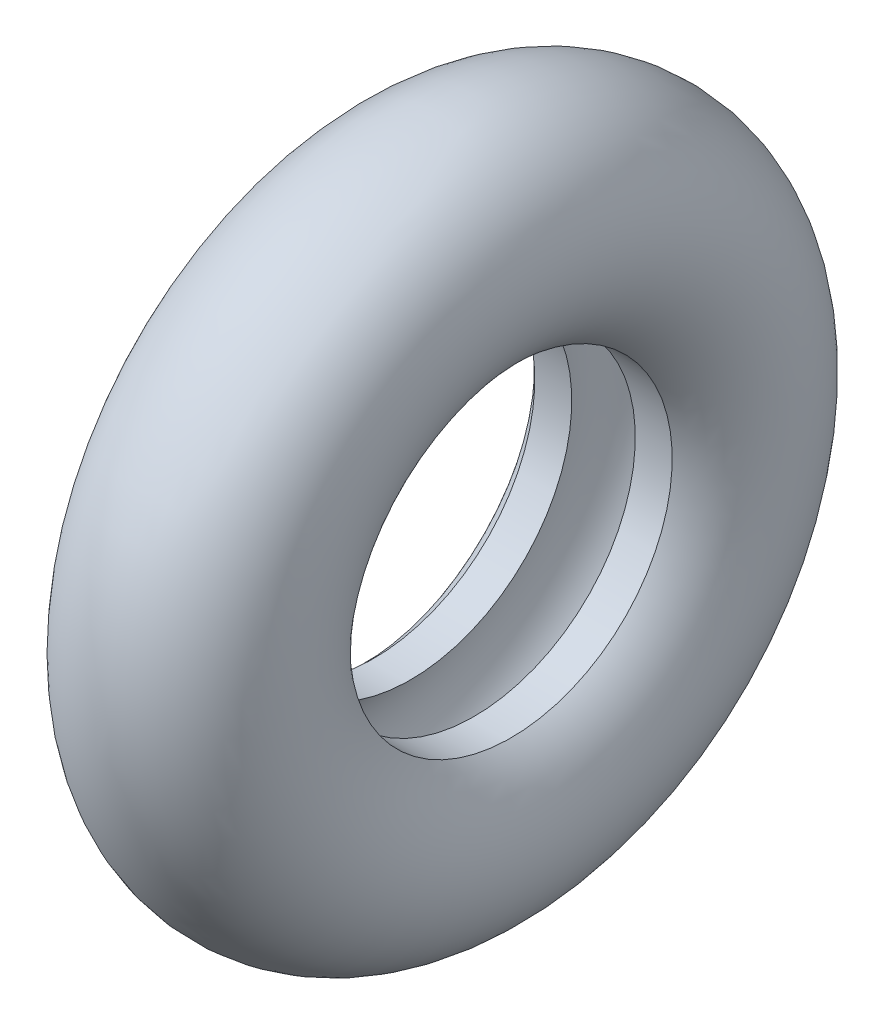
ISO-10303-21;
HEADER;
FILE_DESCRIPTION(('STEP AP214'),'2;1');
FILE_NAME('part.step','',(''),(''),'','','');
FILE_SCHEMA(('AUTOMOTIVE_DESIGN { 1 0 10303 214 1 1 1 1 }'));
ENDSEC;
DATA;
#1=APPLICATION_CONTEXT('core data for automotive mechanical design processes');
#2=APPLICATION_PROTOCOL_DEFINITION('international standard','automotive_design',2000,#1);
#3=PRODUCT_CONTEXT('',#1,'mechanical');
#4=PRODUCT('Part','Part','',(#3));
#5=PRODUCT_RELATED_PRODUCT_CATEGORY('part','',(#4));
#6=PRODUCT_DEFINITION_FORMATION('','',#4);
#7=PRODUCT_DEFINITION_CONTEXT('part definition',#1,'design');
#8=PRODUCT_DEFINITION('design','',#6,#7);
#9=PRODUCT_DEFINITION_SHAPE('','',#8);
#10=(LENGTH_UNIT() NAMED_UNIT(*) SI_UNIT(.MILLI.,.METRE.));
#11=(NAMED_UNIT(*) PLANE_ANGLE_UNIT() SI_UNIT($,.RADIAN.));
#12=(NAMED_UNIT(*) SI_UNIT($,.STERADIAN.) SOLID_ANGLE_UNIT());
#13=UNCERTAINTY_MEASURE_WITH_UNIT(LENGTH_MEASURE(1.E-05),#10,'distance_accuracy_value','');
#14=(GEOMETRIC_REPRESENTATION_CONTEXT(3) GLOBAL_UNCERTAINTY_ASSIGNED_CONTEXT((#13)) GLOBAL_UNIT_ASSIGNED_CONTEXT((#10,
#11,#12)) REPRESENTATION_CONTEXT('',''));
#15=CARTESIAN_POINT('',(0.,0.,0.));
#16=DIRECTION('',(0.,0.,1.));
#17=DIRECTION('',(1.,0.,0.));
#18=AXIS2_PLACEMENT_3D('',#15,#16,#17);
#19=CARTESIAN_POINT('',(0.,0.,0.));
#20=DIRECTION('',(-1.,0.,0.));
#21=DIRECTION('',(0.,0.,1.));
#22=AXIS2_PLACEMENT_3D('',#19,#20,#21);
#23=TOROIDAL_SURFACE('',#22,128.44,56.555);
#24=CARTESIAN_POINT('',(-36.2137325471982,0.,0.));
#25=DIRECTION('',(-1.,0.,0.));
#26=DIRECTION('',(0.,0.,1.));
#27=AXIS2_PLACEMENT_3D('',#24,#25,#26);
#28=CIRCLE('',#27,85.);
#29=CARTESIAN_POINT('',(-36.2137325471982,0.,85.));
#30=VERTEX_POINT('',#29);
#31=EDGE_CURVE('E10',#30,#30,#28,.T.);
#32=ORIENTED_EDGE('',*,*,#31,.F.);
#33=EDGE_LOOP('',(#32));
#34=FACE_BOUND('',#33,.T.);
#35=CARTESIAN_POINT('',(36.2137325471982,0.,0.));
#36=DIRECTION('',(-1.,0.,0.));
#37=DIRECTION('',(0.,0.,1.));
#38=AXIS2_PLACEMENT_3D('',#35,#36,#37);
#39=CIRCLE('',#38,85.);
#40=CARTESIAN_POINT('',(36.2137325471982,0.,85.));
#41=VERTEX_POINT('',#40);
#42=EDGE_CURVE('E46',#41,#41,#39,.T.);
#43=ORIENTED_EDGE('',*,*,#42,.T.);
#44=EDGE_LOOP('',(#43));
#45=FACE_BOUND('',#44,.T.);
#46=ADVANCED_FACE('F32',(#34,#45),#23,.T.);
#47=CARTESIAN_POINT('',(-106.608138564992,0.,0.));
#48=DIRECTION('',(-1.,0.,0.));
#49=DIRECTION('',(0.,0.,1.));
#50=AXIS2_PLACEMENT_3D('',#47,#48,#49);
#51=CYLINDRICAL_SURFACE('',#50,85.);
#52=CARTESIAN_POINT('',(-16.743190406849,0.,0.));
#53=DIRECTION('',(-1.,0.,0.));
#54=DIRECTION('',(0.,0.,1.));
#55=AXIS2_PLACEMENT_3D('',#52,#53,#54);
#56=CIRCLE('',#55,85.);
#57=CARTESIAN_POINT('',(-16.743190406849,0.,85.));
#58=VERTEX_POINT('',#57);
#59=EDGE_CURVE('E38',#58,#58,#56,.T.);
#60=ORIENTED_EDGE('',*,*,#59,.F.);
#61=EDGE_LOOP('',(#60));
#62=FACE_BOUND('',#61,.T.);
#63=ORIENTED_EDGE('',*,*,#31,.T.);
#64=EDGE_LOOP('',(#63));
#65=FACE_BOUND('',#64,.T.);
#66=ADVANCED_FACE('F61',(#62,#65),#51,.F.);
#67=CARTESIAN_POINT('',(0.,0.,0.));
#68=DIRECTION('',(-1.,0.,0.));
#69=DIRECTION('',(0.,0.,1.));
#70=AXIS2_PLACEMENT_3D('',#67,#68,#69);
#71=TOROIDAL_SURFACE('',#70,128.44,46.555);
#72=CARTESIAN_POINT('',(16.743190406849,0.,0.));
#73=DIRECTION('',(-1.,0.,0.));
#74=DIRECTION('',(0.,0.,1.));
#75=AXIS2_PLACEMENT_3D('',#72,#73,#74);
#76=CIRCLE('',#75,85.);
#77=CARTESIAN_POINT('',(16.743190406849,0.,85.));
#78=VERTEX_POINT('',#77);
#79=EDGE_CURVE('E42',#78,#78,#76,.T.);
#80=ORIENTED_EDGE('',*,*,#79,.F.);
#81=EDGE_LOOP('',(#80));
#82=FACE_BOUND('',#81,.T.);
#83=ORIENTED_EDGE('',*,*,#59,.T.);
#84=EDGE_LOOP('',(#83));
#85=FACE_BOUND('',#84,.T.);
#86=ADVANCED_FACE('F56',(#82,#85),#71,.F.);
#87=CARTESIAN_POINT('',(-106.608138564992,0.,0.));
#88=DIRECTION('',(-1.,0.,0.));
#89=DIRECTION('',(0.,0.,1.));
#90=AXIS2_PLACEMENT_3D('',#87,#88,#89);
#91=CYLINDRICAL_SURFACE('',#90,85.);
#92=ORIENTED_EDGE('',*,*,#42,.F.);
#93=EDGE_LOOP('',(#92));
#94=FACE_BOUND('',#93,.T.);
#95=ORIENTED_EDGE('',*,*,#79,.T.);
#96=EDGE_LOOP('',(#95));
#97=FACE_BOUND('',#96,.T.);
#98=ADVANCED_FACE('F53',(#94,#97),#91,.F.);
#99=CLOSED_SHELL('',(#46,#66,#86,#98));
#100=MANIFOLD_SOLID_BREP('B2',#99);
#101=ADVANCED_BREP_SHAPE_REPRESENTATION('',(#18,#100),#14);
#102=SHAPE_DEFINITION_REPRESENTATION(#9,#101);
ENDSEC;
END-ISO-10303-21;
